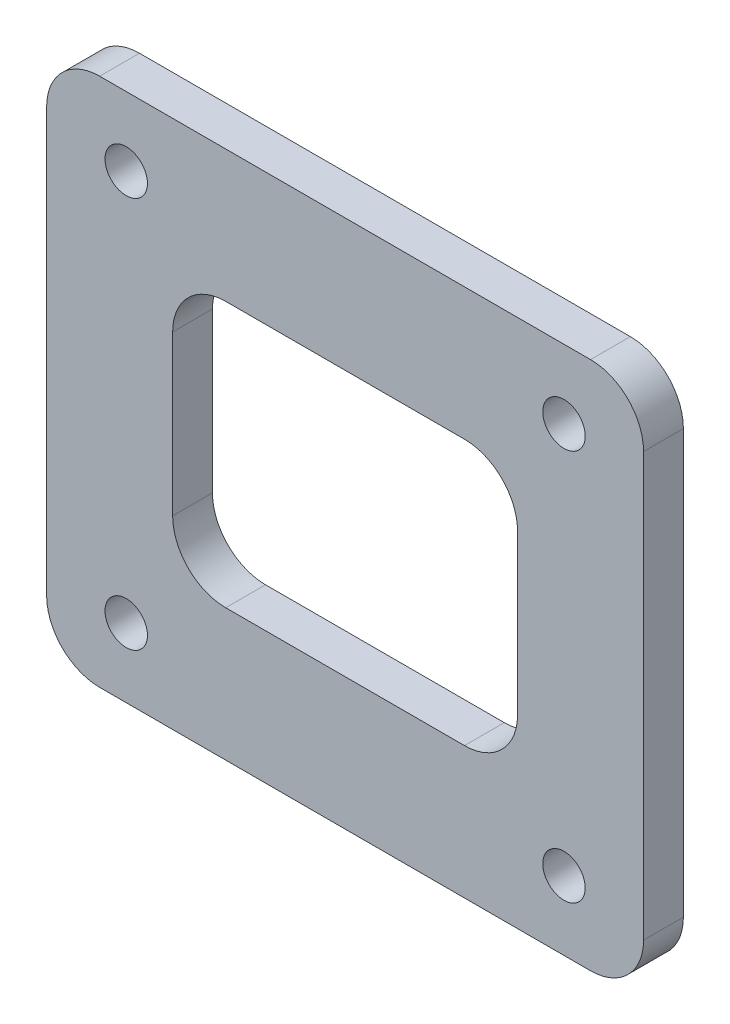
ISO-10303-21;
HEADER;
FILE_DESCRIPTION(('STEP AP214'),'2;1');
FILE_NAME('part.step','',(''),(''),'','','');
FILE_SCHEMA(('AUTOMOTIVE_DESIGN { 1 0 10303 214 1 1 1 1 }'));
ENDSEC;
DATA;
#1=APPLICATION_CONTEXT('core data for automotive mechanical design processes');
#2=APPLICATION_PROTOCOL_DEFINITION('international standard','automotive_design',2000,#1);
#3=PRODUCT_CONTEXT('',#1,'mechanical');
#4=PRODUCT('Part','Part','',(#3));
#5=PRODUCT_RELATED_PRODUCT_CATEGORY('part','',(#4));
#6=PRODUCT_DEFINITION_FORMATION('','',#4);
#7=PRODUCT_DEFINITION_CONTEXT('part definition',#1,'design');
#8=PRODUCT_DEFINITION('design','',#6,#7);
#9=PRODUCT_DEFINITION_SHAPE('','',#8);
#10=(LENGTH_UNIT() NAMED_UNIT(*) SI_UNIT(.MILLI.,.METRE.));
#11=(NAMED_UNIT(*) PLANE_ANGLE_UNIT() SI_UNIT($,.RADIAN.));
#12=(NAMED_UNIT(*) SI_UNIT($,.STERADIAN.) SOLID_ANGLE_UNIT());
#13=UNCERTAINTY_MEASURE_WITH_UNIT(LENGTH_MEASURE(1.E-05),#10,'distance_accuracy_value','');
#14=(GEOMETRIC_REPRESENTATION_CONTEXT(3) GLOBAL_UNCERTAINTY_ASSIGNED_CONTEXT((#13)) GLOBAL_UNIT_ASSIGNED_CONTEXT((#10,
#11,#12)) REPRESENTATION_CONTEXT('',''));
#15=CARTESIAN_POINT('',(0.,0.,0.));
#16=DIRECTION('',(0.,0.,1.));
#17=DIRECTION('',(1.,0.,0.));
#18=AXIS2_PLACEMENT_3D('',#15,#16,#17);
#19=CARTESIAN_POINT('',(0.,0.,3.));
#20=DIRECTION('',(0.,0.,1.));
#21=DIRECTION('',(1.,0.,0.));
#22=AXIS2_PLACEMENT_3D('',#19,#20,#21);
#23=PLANE('',#22);
#24=DIRECTION('',(1.,0.,0.));
#25=VECTOR('',#24,1.);
#26=CARTESIAN_POINT('',(-22.5,19.95,3.));
#27=LINE('',#26,#25);
#28=CARTESIAN_POINT('',(-18.5,19.95,3.));
#29=VERTEX_POINT('',#28);
#30=CARTESIAN_POINT('',(18.5,19.95,3.));
#31=VERTEX_POINT('',#30);
#32=EDGE_CURVE('E250',#29,#31,#27,.T.);
#33=ORIENTED_EDGE('',*,*,#32,.F.);
#34=CARTESIAN_POINT('',(-18.5,15.95,3.));
#35=DIRECTION('',(0.,0.,1.));
#36=DIRECTION('',(1.,0.,0.));
#37=AXIS2_PLACEMENT_3D('',#34,#35,#36);
#38=CIRCLE('',#37,4.);
#39=CARTESIAN_POINT('',(-22.5,15.95,3.));
#40=VERTEX_POINT('',#39);
#41=EDGE_CURVE('E214',#40,#29,#38,.F.);
#42=ORIENTED_EDGE('',*,*,#41,.F.);
#43=DIRECTION('',(0.,1.,0.));
#44=VECTOR('',#43,1.);
#45=CARTESIAN_POINT('',(-22.5,19.95,3.));
#46=LINE('',#45,#44);
#47=CARTESIAN_POINT('',(-22.5,-15.95,3.));
#48=VERTEX_POINT('',#47);
#49=EDGE_CURVE('E213',#40,#48,#46,.F.);
#50=ORIENTED_EDGE('',*,*,#49,.T.);
#51=CARTESIAN_POINT('',(-18.5,-15.95,3.));
#52=DIRECTION('',(0.,0.,-1.));
#53=DIRECTION('',(-1.,0.,0.));
#54=AXIS2_PLACEMENT_3D('',#51,#52,#53);
#55=CIRCLE('',#54,4.);
#56=CARTESIAN_POINT('',(-18.5,-19.95,3.));
#57=VERTEX_POINT('',#56);
#58=EDGE_CURVE('E210',#57,#48,#55,.T.);
#59=ORIENTED_EDGE('',*,*,#58,.F.);
#60=DIRECTION('',(1.,0.,0.));
#61=VECTOR('',#60,1.);
#62=CARTESIAN_POINT('',(-22.5,-19.95,3.));
#63=LINE('',#62,#61);
#64=CARTESIAN_POINT('',(18.5,-19.95,3.));
#65=VERTEX_POINT('',#64);
#66=EDGE_CURVE('E209',#57,#65,#63,.T.);
#67=ORIENTED_EDGE('',*,*,#66,.T.);
#68=CARTESIAN_POINT('',(18.5,-15.95,3.));
#69=DIRECTION('',(0.,0.,1.));
#70=DIRECTION('',(1.,0.,0.));
#71=AXIS2_PLACEMENT_3D('',#68,#69,#70);
#72=CIRCLE('',#71,4.);
#73=CARTESIAN_POINT('',(22.5,-15.95,3.));
#74=VERTEX_POINT('',#73);
#75=EDGE_CURVE('E222',#74,#65,#72,.F.);
#76=ORIENTED_EDGE('',*,*,#75,.F.);
#77=DIRECTION('',(0.,1.,0.));
#78=VECTOR('',#77,1.);
#79=CARTESIAN_POINT('',(22.5,19.95,3.));
#80=LINE('',#79,#78);
#81=CARTESIAN_POINT('',(22.5,15.95,3.));
#82=VERTEX_POINT('',#81);
#83=EDGE_CURVE('E156',#82,#74,#80,.F.);
#84=ORIENTED_EDGE('',*,*,#83,.F.);
#85=CARTESIAN_POINT('',(18.5,15.95,3.));
#86=DIRECTION('',(0.,0.,-1.));
#87=DIRECTION('',(-1.,0.,0.));
#88=AXIS2_PLACEMENT_3D('',#85,#86,#87);
#89=CIRCLE('',#88,4.);
#90=EDGE_CURVE('E218',#31,#82,#89,.T.);
#91=ORIENTED_EDGE('',*,*,#90,.F.);
#92=EDGE_LOOP('',(#33,#42,#50,#59,#67,#76,#84,#91));
#93=FACE_BOUND('',#92,.T.);
#94=CARTESIAN_POINT('',(-16.5,14.75,3.));
#95=DIRECTION('',(0.,0.,1.));
#96=DIRECTION('',(1.,0.,0.));
#97=AXIS2_PLACEMENT_3D('',#94,#95,#96);
#98=CIRCLE('',#97,1.6);
#99=CARTESIAN_POINT('',(-14.9,14.75,3.));
#100=VERTEX_POINT('',#99);
#101=EDGE_CURVE('E224',#100,#100,#98,.F.);
#102=ORIENTED_EDGE('',*,*,#101,.T.);
#103=EDGE_LOOP('',(#102));
#104=FACE_BOUND('',#103,.T.);
#105=CARTESIAN_POINT('',(16.5,14.75,3.));
#106=DIRECTION('',(0.,0.,1.));
#107=DIRECTION('',(1.,0.,0.));
#108=AXIS2_PLACEMENT_3D('',#105,#106,#107);
#109=CIRCLE('',#108,1.6);
#110=CARTESIAN_POINT('',(18.1,14.75,3.));
#111=VERTEX_POINT('',#110);
#112=EDGE_CURVE('E227',#111,#111,#109,.F.);
#113=ORIENTED_EDGE('',*,*,#112,.T.);
#114=EDGE_LOOP('',(#113));
#115=FACE_BOUND('',#114,.T.);
#116=CARTESIAN_POINT('',(16.5,-14.75,3.));
#117=DIRECTION('',(0.,0.,1.));
#118=DIRECTION('',(1.,0.,0.));
#119=AXIS2_PLACEMENT_3D('',#116,#117,#118);
#120=CIRCLE('',#119,1.6);
#121=CARTESIAN_POINT('',(18.1,-14.75,3.));
#122=VERTEX_POINT('',#121);
#123=EDGE_CURVE('E151',#122,#122,#120,.F.);
#124=ORIENTED_EDGE('',*,*,#123,.T.);
#125=EDGE_LOOP('',(#124));
#126=FACE_BOUND('',#125,.T.);
#127=CARTESIAN_POINT('',(-16.5,-14.75,3.));
#128=DIRECTION('',(0.,0.,1.));
#129=DIRECTION('',(1.,0.,0.));
#130=AXIS2_PLACEMENT_3D('',#127,#128,#129);
#131=CIRCLE('',#130,1.6);
#132=CARTESIAN_POINT('',(-14.9,-14.75,3.));
#133=VERTEX_POINT('',#132);
#134=EDGE_CURVE('E148',#133,#133,#131,.F.);
#135=ORIENTED_EDGE('',*,*,#134,.T.);
#136=EDGE_LOOP('',(#135));
#137=FACE_BOUND('',#136,.T.);
#138=DIRECTION('',(1.,0.,0.));
#139=VECTOR('',#138,1.);
#140=CARTESIAN_POINT('',(-13.,10.,3.));
#141=LINE('',#140,#139);
#142=CARTESIAN_POINT('',(-9.,10.,3.));
#143=VERTEX_POINT('',#142);
#144=CARTESIAN_POINT('',(9.,10.,3.));
#145=VERTEX_POINT('',#144);
#146=EDGE_CURVE('E166',#143,#145,#141,.T.);
#147=ORIENTED_EDGE('',*,*,#146,.T.);
#148=CARTESIAN_POINT('',(9.,6.,3.));
#149=DIRECTION('',(0.,0.,-1.));
#150=DIRECTION('',(-1.,0.,0.));
#151=AXIS2_PLACEMENT_3D('',#148,#149,#150);
#152=CIRCLE('',#151,4.);
#153=CARTESIAN_POINT('',(13.,6.,3.));
#154=VERTEX_POINT('',#153);
#155=EDGE_CURVE('E234',#145,#154,#152,.T.);
#156=ORIENTED_EDGE('',*,*,#155,.T.);
#157=DIRECTION('',(0.,1.,0.));
#158=VECTOR('',#157,1.);
#159=CARTESIAN_POINT('',(13.,10.,3.));
#160=LINE('',#159,#158);
#161=CARTESIAN_POINT('',(13.,-6.,3.));
#162=VERTEX_POINT('',#161);
#163=EDGE_CURVE('E162',#154,#162,#160,.F.);
#164=ORIENTED_EDGE('',*,*,#163,.T.);
#165=CARTESIAN_POINT('',(9.,-6.,3.));
#166=DIRECTION('',(0.,0.,-1.));
#167=DIRECTION('',(-1.,0.,0.));
#168=AXIS2_PLACEMENT_3D('',#165,#166,#167);
#169=CIRCLE('',#168,4.);
#170=CARTESIAN_POINT('',(9.,-10.,3.));
#171=VERTEX_POINT('',#170);
#172=EDGE_CURVE('E233',#162,#171,#169,.T.);
#173=ORIENTED_EDGE('',*,*,#172,.T.);
#174=DIRECTION('',(1.,0.,0.));
#175=VECTOR('',#174,1.);
#176=CARTESIAN_POINT('',(-13.,-10.,3.));
#177=LINE('',#176,#175);
#178=CARTESIAN_POINT('',(-9.,-10.,3.));
#179=VERTEX_POINT('',#178);
#180=EDGE_CURVE('E158',#171,#179,#177,.F.);
#181=ORIENTED_EDGE('',*,*,#180,.T.);
#182=CARTESIAN_POINT('',(-9.,-6.,3.));
#183=DIRECTION('',(0.,0.,-1.));
#184=DIRECTION('',(-1.,0.,0.));
#185=AXIS2_PLACEMENT_3D('',#182,#183,#184);
#186=CIRCLE('',#185,4.);
#187=CARTESIAN_POINT('',(-13.,-6.,3.));
#188=VERTEX_POINT('',#187);
#189=EDGE_CURVE('E145',#179,#188,#186,.T.);
#190=ORIENTED_EDGE('',*,*,#189,.T.);
#191=DIRECTION('',(0.,-1.,0.));
#192=VECTOR('',#191,1.);
#193=CARTESIAN_POINT('',(-13.,10.,3.));
#194=LINE('',#193,#192);
#195=CARTESIAN_POINT('',(-13.,6.,3.));
#196=VERTEX_POINT('',#195);
#197=EDGE_CURVE('E140',#188,#196,#194,.F.);
#198=ORIENTED_EDGE('',*,*,#197,.T.);
#199=CARTESIAN_POINT('',(-9.,6.,3.));
#200=DIRECTION('',(0.,0.,-1.));
#201=DIRECTION('',(-1.,0.,0.));
#202=AXIS2_PLACEMENT_3D('',#199,#200,#201);
#203=CIRCLE('',#202,4.);
#204=EDGE_CURVE('E20',#196,#143,#203,.T.);
#205=ORIENTED_EDGE('',*,*,#204,.T.);
#206=EDGE_LOOP('',(#147,#156,#164,#173,#181,#190,#198,#205));
#207=FACE_BOUND('',#206,.T.);
#208=ADVANCED_FACE('F17',(#93,#104,#115,#126,#137,#207),#23,.T.);
#209=CARTESIAN_POINT('',(-9.,6.,0.));
#210=DIRECTION('',(0.,0.,-1.));
#211=DIRECTION('',(-1.,0.,0.));
#212=AXIS2_PLACEMENT_3D('',#209,#210,#211);
#213=CYLINDRICAL_SURFACE('',#212,4.);
#214=DIRECTION('',(0.,0.,1.));
#215=VECTOR('',#214,1.);
#216=CARTESIAN_POINT('',(-9.,10.,0.));
#217=LINE('',#216,#215);
#218=CARTESIAN_POINT('',(-9.,10.,0.));
#219=VERTEX_POINT('',#218);
#220=EDGE_CURVE('E133',#219,#143,#217,.T.);
#221=ORIENTED_EDGE('',*,*,#220,.T.);
#222=ORIENTED_EDGE('',*,*,#204,.F.);
#223=DIRECTION('',(0.,0.,1.));
#224=VECTOR('',#223,1.);
#225=CARTESIAN_POINT('',(-13.,6.,0.));
#226=LINE('',#225,#224);
#227=CARTESIAN_POINT('',(-13.,6.,0.));
#228=VERTEX_POINT('',#227);
#229=EDGE_CURVE('E131',#196,#228,#226,.F.);
#230=ORIENTED_EDGE('',*,*,#229,.T.);
#231=CARTESIAN_POINT('',(-9.,6.,0.));
#232=DIRECTION('',(0.,0.,-1.));
#233=DIRECTION('',(-1.,0.,0.));
#234=AXIS2_PLACEMENT_3D('',#231,#232,#233);
#235=CIRCLE('',#234,4.);
#236=EDGE_CURVE('E207',#228,#219,#235,.T.);
#237=ORIENTED_EDGE('',*,*,#236,.T.);
#238=EDGE_LOOP('',(#221,#222,#230,#237));
#239=FACE_BOUND('',#238,.T.);
#240=ADVANCED_FACE('F129',(#239),#213,.F.);
#241=CARTESIAN_POINT('',(-13.,10.,0.));
#242=DIRECTION('',(0.,1.,0.));
#243=DIRECTION('',(0.,0.,1.));
#244=AXIS2_PLACEMENT_3D('',#241,#242,#243);
#245=PLANE('',#244);
#246=DIRECTION('',(0.,0.,-1.));
#247=VECTOR('',#246,1.);
#248=CARTESIAN_POINT('',(9.,10.,0.));
#249=LINE('',#248,#247);
#250=CARTESIAN_POINT('',(9.,10.,0.));
#251=VERTEX_POINT('',#250);
#252=EDGE_CURVE('E168',#251,#145,#249,.F.);
#253=ORIENTED_EDGE('',*,*,#252,.T.);
#254=ORIENTED_EDGE('',*,*,#146,.F.);
#255=ORIENTED_EDGE('',*,*,#220,.F.);
#256=DIRECTION('',(1.,0.,0.));
#257=VECTOR('',#256,1.);
#258=CARTESIAN_POINT('',(0.,10.,0.));
#259=LINE('',#258,#257);
#260=EDGE_CURVE('E206',#219,#251,#259,.T.);
#261=ORIENTED_EDGE('',*,*,#260,.T.);
#262=EDGE_LOOP('',(#253,#254,#255,#261));
#263=FACE_BOUND('',#262,.T.);
#264=ADVANCED_FACE('F487',(#263),#245,.F.);
#265=CARTESIAN_POINT('',(9.,6.,0.));
#266=DIRECTION('',(0.,0.,-1.));
#267=DIRECTION('',(-1.,0.,0.));
#268=AXIS2_PLACEMENT_3D('',#265,#266,#267);
#269=CYLINDRICAL_SURFACE('',#268,4.);
#270=DIRECTION('',(0.,0.,1.));
#271=VECTOR('',#270,1.);
#272=CARTESIAN_POINT('',(13.,6.,0.));
#273=LINE('',#272,#271);
#274=CARTESIAN_POINT('',(13.,6.,0.));
#275=VERTEX_POINT('',#274);
#276=EDGE_CURVE('E165',#275,#154,#273,.T.);
#277=ORIENTED_EDGE('',*,*,#276,.T.);
#278=ORIENTED_EDGE('',*,*,#155,.F.);
#279=ORIENTED_EDGE('',*,*,#252,.F.);
#280=CARTESIAN_POINT('',(9.,6.,0.));
#281=DIRECTION('',(0.,0.,-1.));
#282=DIRECTION('',(-1.,0.,0.));
#283=AXIS2_PLACEMENT_3D('',#280,#281,#282);
#284=CIRCLE('',#283,4.);
#285=EDGE_CURVE('E203',#251,#275,#284,.T.);
#286=ORIENTED_EDGE('',*,*,#285,.T.);
#287=EDGE_LOOP('',(#277,#278,#279,#286));
#288=FACE_BOUND('',#287,.T.);
#289=ADVANCED_FACE('F479',(#288),#269,.F.);
#290=CARTESIAN_POINT('',(13.,10.,0.));
#291=DIRECTION('',(1.,0.,0.));
#292=DIRECTION('',(0.,1.,0.));
#293=AXIS2_PLACEMENT_3D('',#290,#291,#292);
#294=PLANE('',#293);
#295=DIRECTION('',(0.,0.,-1.));
#296=VECTOR('',#295,1.);
#297=CARTESIAN_POINT('',(13.,-6.,0.));
#298=LINE('',#297,#296);
#299=CARTESIAN_POINT('',(13.,-6.,0.));
#300=VERTEX_POINT('',#299);
#301=EDGE_CURVE('E164',#300,#162,#298,.F.);
#302=ORIENTED_EDGE('',*,*,#301,.T.);
#303=ORIENTED_EDGE('',*,*,#163,.F.);
#304=ORIENTED_EDGE('',*,*,#276,.F.);
#305=DIRECTION('',(0.,1.,0.));
#306=VECTOR('',#305,1.);
#307=CARTESIAN_POINT('',(13.,0.,0.));
#308=LINE('',#307,#306);
#309=EDGE_CURVE('E202',#275,#300,#308,.F.);
#310=ORIENTED_EDGE('',*,*,#309,.T.);
#311=EDGE_LOOP('',(#302,#303,#304,#310));
#312=FACE_BOUND('',#311,.T.);
#313=ADVANCED_FACE('F269',(#312),#294,.F.);
#314=CARTESIAN_POINT('',(9.,-6.,0.));
#315=DIRECTION('',(0.,0.,-1.));
#316=DIRECTION('',(-1.,0.,0.));
#317=AXIS2_PLACEMENT_3D('',#314,#315,#316);
#318=CYLINDRICAL_SURFACE('',#317,4.);
#319=DIRECTION('',(0.,0.,-1.));
#320=VECTOR('',#319,1.);
#321=CARTESIAN_POINT('',(9.,-10.,0.));
#322=LINE('',#321,#320);
#323=CARTESIAN_POINT('',(9.,-10.,0.));
#324=VERTEX_POINT('',#323);
#325=EDGE_CURVE('E161',#324,#171,#322,.F.);
#326=ORIENTED_EDGE('',*,*,#325,.T.);
#327=ORIENTED_EDGE('',*,*,#172,.F.);
#328=ORIENTED_EDGE('',*,*,#301,.F.);
#329=CARTESIAN_POINT('',(9.,-6.,0.));
#330=DIRECTION('',(0.,0.,-1.));
#331=DIRECTION('',(-1.,0.,0.));
#332=AXIS2_PLACEMENT_3D('',#329,#330,#331);
#333=CIRCLE('',#332,4.);
#334=EDGE_CURVE('E199',#300,#324,#333,.T.);
#335=ORIENTED_EDGE('',*,*,#334,.T.);
#336=EDGE_LOOP('',(#326,#327,#328,#335));
#337=FACE_BOUND('',#336,.T.);
#338=ADVANCED_FACE('F274',(#337),#318,.F.);
#339=CARTESIAN_POINT('',(-13.,-10.,0.));
#340=DIRECTION('',(0.,-1.,0.));
#341=DIRECTION('',(0.,0.,-1.));
#342=AXIS2_PLACEMENT_3D('',#339,#340,#341);
#343=PLANE('',#342);
#344=DIRECTION('',(0.,0.,-1.));
#345=VECTOR('',#344,1.);
#346=CARTESIAN_POINT('',(-9.,-10.,0.));
#347=LINE('',#346,#345);
#348=CARTESIAN_POINT('',(-9.,-10.,0.));
#349=VERTEX_POINT('',#348);
#350=EDGE_CURVE('E160',#349,#179,#347,.F.);
#351=ORIENTED_EDGE('',*,*,#350,.T.);
#352=ORIENTED_EDGE('',*,*,#180,.F.);
#353=ORIENTED_EDGE('',*,*,#325,.F.);
#354=DIRECTION('',(1.,0.,0.));
#355=VECTOR('',#354,1.);
#356=CARTESIAN_POINT('',(0.,-10.,0.));
#357=LINE('',#356,#355);
#358=EDGE_CURVE('E198',#324,#349,#357,.F.);
#359=ORIENTED_EDGE('',*,*,#358,.T.);
#360=EDGE_LOOP('',(#351,#352,#353,#359));
#361=FACE_BOUND('',#360,.T.);
#362=ADVANCED_FACE('F456',(#361),#343,.F.);
#363=CARTESIAN_POINT('',(-9.,-6.,0.));
#364=DIRECTION('',(0.,0.,-1.));
#365=DIRECTION('',(-1.,0.,0.));
#366=AXIS2_PLACEMENT_3D('',#363,#364,#365);
#367=CYLINDRICAL_SURFACE('',#366,4.);
#368=DIRECTION('',(0.,0.,1.));
#369=VECTOR('',#368,1.);
#370=CARTESIAN_POINT('',(-13.,-6.,0.));
#371=LINE('',#370,#369);
#372=CARTESIAN_POINT('',(-13.,-6.,0.));
#373=VERTEX_POINT('',#372);
#374=EDGE_CURVE('E144',#373,#188,#371,.T.);
#375=ORIENTED_EDGE('',*,*,#374,.T.);
#376=ORIENTED_EDGE('',*,*,#189,.F.);
#377=ORIENTED_EDGE('',*,*,#350,.F.);
#378=CARTESIAN_POINT('',(-9.,-6.,0.));
#379=DIRECTION('',(0.,0.,-1.));
#380=DIRECTION('',(-1.,0.,0.));
#381=AXIS2_PLACEMENT_3D('',#378,#379,#380);
#382=CIRCLE('',#381,4.);
#383=EDGE_CURVE('E195',#349,#373,#382,.T.);
#384=ORIENTED_EDGE('',*,*,#383,.T.);
#385=EDGE_LOOP('',(#375,#376,#377,#384));
#386=FACE_BOUND('',#385,.T.);
#387=ADVANCED_FACE('F448',(#386),#367,.F.);
#388=CARTESIAN_POINT('',(-13.,10.,0.));
#389=DIRECTION('',(-1.,0.,0.));
#390=DIRECTION('',(0.,-1.,0.));
#391=AXIS2_PLACEMENT_3D('',#388,#389,#390);
#392=PLANE('',#391);
#393=ORIENTED_EDGE('',*,*,#374,.F.);
#394=DIRECTION('',(0.,1.,0.));
#395=VECTOR('',#394,1.);
#396=CARTESIAN_POINT('',(-13.,0.,0.));
#397=LINE('',#396,#395);
#398=EDGE_CURVE('E143',#373,#228,#397,.T.);
#399=ORIENTED_EDGE('',*,*,#398,.T.);
#400=ORIENTED_EDGE('',*,*,#229,.F.);
#401=ORIENTED_EDGE('',*,*,#197,.F.);
#402=EDGE_LOOP('',(#393,#399,#400,#401));
#403=FACE_BOUND('',#402,.T.);
#404=ADVANCED_FACE('F139',(#403),#392,.F.);
#405=CARTESIAN_POINT('',(-16.5,-14.75,0.));
#406=DIRECTION('',(0.,0.,1.));
#407=DIRECTION('',(1.,0.,0.));
#408=AXIS2_PLACEMENT_3D('',#405,#406,#407);
#409=CYLINDRICAL_SURFACE('',#408,1.6);
#410=CARTESIAN_POINT('',(-16.5,-14.75,0.));
#411=DIRECTION('',(0.,0.,1.));
#412=DIRECTION('',(1.,0.,0.));
#413=AXIS2_PLACEMENT_3D('',#410,#411,#412);
#414=CIRCLE('',#413,1.6);
#415=CARTESIAN_POINT('',(-14.9,-14.75,0.));
#416=VERTEX_POINT('',#415);
#417=EDGE_CURVE('E192',#416,#416,#414,.F.);
#418=ORIENTED_EDGE('',*,*,#417,.T.);
#419=EDGE_LOOP('',(#418));
#420=FACE_BOUND('',#419,.T.);
#421=ORIENTED_EDGE('',*,*,#134,.F.);
#422=EDGE_LOOP('',(#421));
#423=FACE_BOUND('',#422,.T.);
#424=ADVANCED_FACE('F431',(#420,#423),#409,.F.);
#425=CARTESIAN_POINT('',(16.5,-14.75,0.));
#426=DIRECTION('',(0.,0.,1.));
#427=DIRECTION('',(1.,0.,0.));
#428=AXIS2_PLACEMENT_3D('',#425,#426,#427);
#429=CYLINDRICAL_SURFACE('',#428,1.6);
#430=CARTESIAN_POINT('',(16.5,-14.75,0.));
#431=DIRECTION('',(0.,0.,1.));
#432=DIRECTION('',(1.,0.,0.));
#433=AXIS2_PLACEMENT_3D('',#430,#431,#432);
#434=CIRCLE('',#433,1.6);
#435=CARTESIAN_POINT('',(18.1,-14.75,0.));
#436=VERTEX_POINT('',#435);
#437=EDGE_CURVE('E189',#436,#436,#434,.F.);
#438=ORIENTED_EDGE('',*,*,#437,.T.);
#439=EDGE_LOOP('',(#438));
#440=FACE_BOUND('',#439,.T.);
#441=ORIENTED_EDGE('',*,*,#123,.F.);
#442=EDGE_LOOP('',(#441));
#443=FACE_BOUND('',#442,.T.);
#444=ADVANCED_FACE('F422',(#440,#443),#429,.F.);
#445=CARTESIAN_POINT('',(16.5,14.75,0.));
#446=DIRECTION('',(0.,0.,1.));
#447=DIRECTION('',(1.,0.,0.));
#448=AXIS2_PLACEMENT_3D('',#445,#446,#447);
#449=CYLINDRICAL_SURFACE('',#448,1.6);
#450=CARTESIAN_POINT('',(16.5,14.75,0.));
#451=DIRECTION('',(0.,0.,1.));
#452=DIRECTION('',(1.,0.,0.));
#453=AXIS2_PLACEMENT_3D('',#450,#451,#452);
#454=CIRCLE('',#453,1.6);
#455=CARTESIAN_POINT('',(18.1,14.75,0.));
#456=VERTEX_POINT('',#455);
#457=EDGE_CURVE('E186',#456,#456,#454,.F.);
#458=ORIENTED_EDGE('',*,*,#457,.T.);
#459=EDGE_LOOP('',(#458));
#460=FACE_BOUND('',#459,.T.);
#461=ORIENTED_EDGE('',*,*,#112,.F.);
#462=EDGE_LOOP('',(#461));
#463=FACE_BOUND('',#462,.T.);
#464=ADVANCED_FACE('F413',(#460,#463),#449,.F.);
#465=CARTESIAN_POINT('',(-16.5,14.75,0.));
#466=DIRECTION('',(0.,0.,1.));
#467=DIRECTION('',(1.,0.,0.));
#468=AXIS2_PLACEMENT_3D('',#465,#466,#467);
#469=CYLINDRICAL_SURFACE('',#468,1.6);
#470=CARTESIAN_POINT('',(-16.5,14.75,0.));
#471=DIRECTION('',(0.,0.,1.));
#472=DIRECTION('',(1.,0.,0.));
#473=AXIS2_PLACEMENT_3D('',#470,#471,#472);
#474=CIRCLE('',#473,1.6);
#475=CARTESIAN_POINT('',(-14.9,14.75,0.));
#476=VERTEX_POINT('',#475);
#477=EDGE_CURVE('E183',#476,#476,#474,.F.);
#478=ORIENTED_EDGE('',*,*,#477,.T.);
#479=EDGE_LOOP('',(#478));
#480=FACE_BOUND('',#479,.T.);
#481=ORIENTED_EDGE('',*,*,#101,.F.);
#482=EDGE_LOOP('',(#481));
#483=FACE_BOUND('',#482,.T.);
#484=ADVANCED_FACE('F405',(#480,#483),#469,.F.);
#485=CARTESIAN_POINT('',(18.5,-15.95,3.));
#486=DIRECTION('',(0.,0.,1.));
#487=DIRECTION('',(1.,0.,0.));
#488=AXIS2_PLACEMENT_3D('',#485,#486,#487);
#489=CYLINDRICAL_SURFACE('',#488,4.);
#490=CARTESIAN_POINT('',(18.5,-15.95,0.));
#491=DIRECTION('',(0.,0.,1.));
#492=DIRECTION('',(1.,0.,0.));
#493=AXIS2_PLACEMENT_3D('',#490,#491,#492);
#494=CIRCLE('',#493,4.);
#495=CARTESIAN_POINT('',(18.5,-19.95,0.));
#496=VERTEX_POINT('',#495);
#497=CARTESIAN_POINT('',(22.5,-15.95,0.));
#498=VERTEX_POINT('',#497);
#499=EDGE_CURVE('E180',#496,#498,#494,.T.);
#500=ORIENTED_EDGE('',*,*,#499,.T.);
#501=DIRECTION('',(0.,0.,-1.));
#502=VECTOR('',#501,1.);
#503=CARTESIAN_POINT('',(22.5,-15.95,3.));
#504=LINE('',#503,#502);
#505=EDGE_CURVE('E221',#74,#498,#504,.T.);
#506=ORIENTED_EDGE('',*,*,#505,.F.);
#507=ORIENTED_EDGE('',*,*,#75,.T.);
#508=DIRECTION('',(0.,0.,1.));
#509=VECTOR('',#508,1.);
#510=CARTESIAN_POINT('',(18.5,-19.95,3.));
#511=LINE('',#510,#509);
#512=EDGE_CURVE('E289',#65,#496,#511,.F.);
#513=ORIENTED_EDGE('',*,*,#512,.T.);
#514=EDGE_LOOP('',(#500,#506,#507,#513));
#515=FACE_BOUND('',#514,.T.);
#516=ADVANCED_FACE('F314',(#515),#489,.T.);
#517=CARTESIAN_POINT('',(22.5,19.95,3.));
#518=DIRECTION('',(1.,0.,0.));
#519=DIRECTION('',(0.,0.,-1.));
#520=AXIS2_PLACEMENT_3D('',#517,#518,#519);
#521=PLANE('',#520);
#522=DIRECTION('',(0.,1.,0.));
#523=VECTOR('',#522,1.);
#524=CARTESIAN_POINT('',(22.5,0.,0.));
#525=LINE('',#524,#523);
#526=CARTESIAN_POINT('',(22.5,15.95,0.));
#527=VERTEX_POINT('',#526);
#528=EDGE_CURVE('E179',#498,#527,#525,.T.);
#529=ORIENTED_EDGE('',*,*,#528,.T.);
#530=DIRECTION('',(0.,0.,-1.));
#531=VECTOR('',#530,1.);
#532=CARTESIAN_POINT('',(22.5,15.95,3.));
#533=LINE('',#532,#531);
#534=EDGE_CURVE('E220',#82,#527,#533,.T.);
#535=ORIENTED_EDGE('',*,*,#534,.F.);
#536=ORIENTED_EDGE('',*,*,#83,.T.);
#537=ORIENTED_EDGE('',*,*,#505,.T.);
#538=EDGE_LOOP('',(#529,#535,#536,#537));
#539=FACE_BOUND('',#538,.T.);
#540=ADVANCED_FACE('F311',(#539),#521,.T.);
#541=CARTESIAN_POINT('',(18.5,15.95,3.));
#542=DIRECTION('',(0.,0.,-1.));
#543=DIRECTION('',(-1.,0.,0.));
#544=AXIS2_PLACEMENT_3D('',#541,#542,#543);
#545=CYLINDRICAL_SURFACE('',#544,4.);
#546=CARTESIAN_POINT('',(18.5,15.95,0.));
#547=DIRECTION('',(0.,0.,-1.));
#548=DIRECTION('',(-1.,0.,0.));
#549=AXIS2_PLACEMENT_3D('',#546,#547,#548);
#550=CIRCLE('',#549,4.);
#551=CARTESIAN_POINT('',(18.5,19.95,0.));
#552=VERTEX_POINT('',#551);
#553=EDGE_CURVE('E176',#527,#552,#550,.F.);
#554=ORIENTED_EDGE('',*,*,#553,.T.);
#555=DIRECTION('',(0.,0.,1.));
#556=VECTOR('',#555,1.);
#557=CARTESIAN_POINT('',(18.5,19.95,3.));
#558=LINE('',#557,#556);
#559=EDGE_CURVE('E217',#31,#552,#558,.F.);
#560=ORIENTED_EDGE('',*,*,#559,.F.);
#561=ORIENTED_EDGE('',*,*,#90,.T.);
#562=ORIENTED_EDGE('',*,*,#534,.T.);
#563=EDGE_LOOP('',(#554,#560,#561,#562));
#564=FACE_BOUND('',#563,.T.);
#565=ADVANCED_FACE('F327',(#564),#545,.T.);
#566=CARTESIAN_POINT('',(-22.5,19.95,3.));
#567=DIRECTION('',(0.,1.,0.));
#568=DIRECTION('',(0.,0.,1.));
#569=AXIS2_PLACEMENT_3D('',#566,#567,#568);
#570=PLANE('',#569);
#571=DIRECTION('',(1.,0.,0.));
#572=VECTOR('',#571,1.);
#573=CARTESIAN_POINT('',(0.,19.95,0.));
#574=LINE('',#573,#572);
#575=CARTESIAN_POINT('',(-18.5,19.95,0.));
#576=VERTEX_POINT('',#575);
#577=EDGE_CURVE('E175',#552,#576,#574,.F.);
#578=ORIENTED_EDGE('',*,*,#577,.T.);
#579=DIRECTION('',(0.,0.,1.));
#580=VECTOR('',#579,1.);
#581=CARTESIAN_POINT('',(-18.5,19.95,3.));
#582=LINE('',#581,#580);
#583=EDGE_CURVE('E216',#29,#576,#582,.F.);
#584=ORIENTED_EDGE('',*,*,#583,.F.);
#585=ORIENTED_EDGE('',*,*,#32,.T.);
#586=ORIENTED_EDGE('',*,*,#559,.T.);
#587=EDGE_LOOP('',(#578,#584,#585,#586));
#588=FACE_BOUND('',#587,.T.);
#589=ADVANCED_FACE('F304',(#588),#570,.T.);
#590=CARTESIAN_POINT('',(-18.5,15.95,3.));
#591=DIRECTION('',(0.,0.,1.));
#592=DIRECTION('',(1.,0.,0.));
#593=AXIS2_PLACEMENT_3D('',#590,#591,#592);
#594=CYLINDRICAL_SURFACE('',#593,4.);
#595=CARTESIAN_POINT('',(-18.5,15.95,0.));
#596=DIRECTION('',(0.,0.,1.));
#597=DIRECTION('',(1.,0.,0.));
#598=AXIS2_PLACEMENT_3D('',#595,#596,#597);
#599=CIRCLE('',#598,4.);
#600=CARTESIAN_POINT('',(-22.5,15.95,0.));
#601=VERTEX_POINT('',#600);
#602=EDGE_CURVE('E172',#576,#601,#599,.T.);
#603=ORIENTED_EDGE('',*,*,#602,.T.);
#604=DIRECTION('',(0.,0.,1.));
#605=VECTOR('',#604,1.);
#606=CARTESIAN_POINT('',(-22.5,15.95,3.));
#607=LINE('',#606,#605);
#608=EDGE_CURVE('E249',#601,#40,#607,.T.);
#609=ORIENTED_EDGE('',*,*,#608,.T.);
#610=ORIENTED_EDGE('',*,*,#41,.T.);
#611=ORIENTED_EDGE('',*,*,#583,.T.);
#612=EDGE_LOOP('',(#603,#609,#610,#611));
#613=FACE_BOUND('',#612,.T.);
#614=ADVANCED_FACE('F296',(#613),#594,.T.);
#615=CARTESIAN_POINT('',(-22.5,19.95,3.));
#616=DIRECTION('',(1.,0.,0.));
#617=DIRECTION('',(0.,1.,0.));
#618=AXIS2_PLACEMENT_3D('',#615,#616,#617);
#619=PLANE('',#618);
#620=DIRECTION('',(0.,0.,-1.));
#621=VECTOR('',#620,1.);
#622=CARTESIAN_POINT('',(-22.5,-15.95,3.));
#623=LINE('',#622,#621);
#624=CARTESIAN_POINT('',(-22.5,-15.95,0.));
#625=VERTEX_POINT('',#624);
#626=EDGE_CURVE('E212',#48,#625,#623,.T.);
#627=ORIENTED_EDGE('',*,*,#626,.F.);
#628=ORIENTED_EDGE('',*,*,#49,.F.);
#629=ORIENTED_EDGE('',*,*,#608,.F.);
#630=DIRECTION('',(0.,1.,0.));
#631=VECTOR('',#630,1.);
#632=CARTESIAN_POINT('',(-22.5,0.,0.));
#633=LINE('',#632,#631);
#634=EDGE_CURVE('E171',#601,#625,#633,.F.);
#635=ORIENTED_EDGE('',*,*,#634,.T.);
#636=EDGE_LOOP('',(#627,#628,#629,#635));
#637=FACE_BOUND('',#636,.T.);
#638=ADVANCED_FACE('F323',(#637),#619,.F.);
#639=CARTESIAN_POINT('',(-18.5,-15.95,3.));
#640=DIRECTION('',(0.,0.,-1.));
#641=DIRECTION('',(-1.,0.,0.));
#642=AXIS2_PLACEMENT_3D('',#639,#640,#641);
#643=CYLINDRICAL_SURFACE('',#642,4.);
#644=CARTESIAN_POINT('',(-18.5,-15.95,0.));
#645=DIRECTION('',(0.,0.,-1.));
#646=DIRECTION('',(-1.,0.,0.));
#647=AXIS2_PLACEMENT_3D('',#644,#645,#646);
#648=CIRCLE('',#647,4.);
#649=CARTESIAN_POINT('',(-18.5,-19.95,0.));
#650=VERTEX_POINT('',#649);
#651=EDGE_CURVE('E26',#625,#650,#648,.F.);
#652=ORIENTED_EDGE('',*,*,#651,.T.);
#653=DIRECTION('',(0.,0.,1.));
#654=VECTOR('',#653,1.);
#655=CARTESIAN_POINT('',(-18.5,-19.95,3.));
#656=LINE('',#655,#654);
#657=EDGE_CURVE('E34',#650,#57,#656,.T.);
#658=ORIENTED_EDGE('',*,*,#657,.T.);
#659=ORIENTED_EDGE('',*,*,#58,.T.);
#660=ORIENTED_EDGE('',*,*,#626,.T.);
#661=EDGE_LOOP('',(#652,#658,#659,#660));
#662=FACE_BOUND('',#661,.T.);
#663=ADVANCED_FACE('F319',(#662),#643,.T.);
#664=CARTESIAN_POINT('',(-22.5,-19.95,3.));
#665=DIRECTION('',(0.,1.,0.));
#666=DIRECTION('',(0.,0.,1.));
#667=AXIS2_PLACEMENT_3D('',#664,#665,#666);
#668=PLANE('',#667);
#669=ORIENTED_EDGE('',*,*,#657,.F.);
#670=DIRECTION('',(1.,0.,0.));
#671=VECTOR('',#670,1.);
#672=CARTESIAN_POINT('',(0.,-19.95,0.));
#673=LINE('',#672,#671);
#674=EDGE_CURVE('E11',#650,#496,#673,.T.);
#675=ORIENTED_EDGE('',*,*,#674,.T.);
#676=ORIENTED_EDGE('',*,*,#512,.F.);
#677=ORIENTED_EDGE('',*,*,#66,.F.);
#678=EDGE_LOOP('',(#669,#675,#676,#677));
#679=FACE_BOUND('',#678,.T.);
#680=ADVANCED_FACE('F317',(#679),#668,.F.);
#681=CARTESIAN_POINT('',(0.,0.,0.));
#682=DIRECTION('',(0.,0.,1.));
#683=DIRECTION('',(1.,0.,0.));
#684=AXIS2_PLACEMENT_3D('',#681,#682,#683);
#685=PLANE('',#684);
#686=ORIENTED_EDGE('',*,*,#651,.F.);
#687=ORIENTED_EDGE('',*,*,#634,.F.);
#688=ORIENTED_EDGE('',*,*,#602,.F.);
#689=ORIENTED_EDGE('',*,*,#577,.F.);
#690=ORIENTED_EDGE('',*,*,#553,.F.);
#691=ORIENTED_EDGE('',*,*,#528,.F.);
#692=ORIENTED_EDGE('',*,*,#499,.F.);
#693=ORIENTED_EDGE('',*,*,#674,.F.);
#694=EDGE_LOOP('',(#686,#687,#688,#689,#690,#691,#692,#693));
#695=FACE_BOUND('',#694,.T.);
#696=ORIENTED_EDGE('',*,*,#477,.F.);
#697=EDGE_LOOP('',(#696));
#698=FACE_BOUND('',#697,.T.);
#699=ORIENTED_EDGE('',*,*,#457,.F.);
#700=EDGE_LOOP('',(#699));
#701=FACE_BOUND('',#700,.T.);
#702=ORIENTED_EDGE('',*,*,#437,.F.);
#703=EDGE_LOOP('',(#702));
#704=FACE_BOUND('',#703,.T.);
#705=ORIENTED_EDGE('',*,*,#417,.F.);
#706=EDGE_LOOP('',(#705));
#707=FACE_BOUND('',#706,.T.);
#708=ORIENTED_EDGE('',*,*,#383,.F.);
#709=ORIENTED_EDGE('',*,*,#358,.F.);
#710=ORIENTED_EDGE('',*,*,#334,.F.);
#711=ORIENTED_EDGE('',*,*,#309,.F.);
#712=ORIENTED_EDGE('',*,*,#285,.F.);
#713=ORIENTED_EDGE('',*,*,#260,.F.);
#714=ORIENTED_EDGE('',*,*,#236,.F.);
#715=ORIENTED_EDGE('',*,*,#398,.F.);
#716=EDGE_LOOP('',(#708,#709,#710,#711,#712,#713,#714,#715));
#717=FACE_BOUND('',#716,.T.);
#718=ADVANCED_FACE('F278',(#695,#698,#701,#704,#707,#717),#685,.F.);
#719=CLOSED_SHELL('',(#208,#240,#264,#289,#313,#338,#362,#387,#404,#424,#444,#464,#484,#516,
#540,#565,#589,#614,#638,#663,#680,#718));
#720=MANIFOLD_SOLID_BREP('B1',#719);
#721=ADVANCED_BREP_SHAPE_REPRESENTATION('',(#18,#720),#14);
#722=SHAPE_DEFINITION_REPRESENTATION(#9,#721);
ENDSEC;
END-ISO-10303-21;
